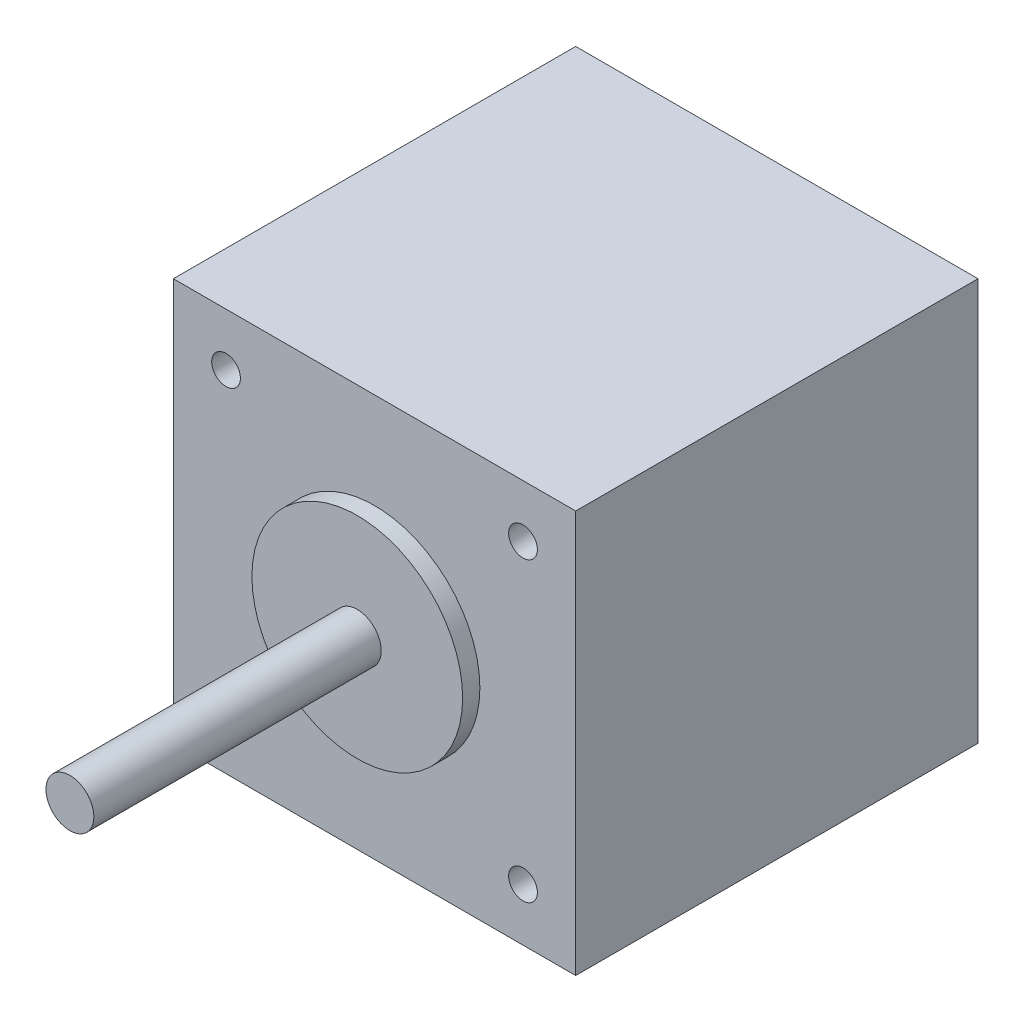
ISO-10303-21;
HEADER;
FILE_DESCRIPTION(('STEP AP214'),'2;1');
FILE_NAME('part.step','',(''),(''),'','','');
FILE_SCHEMA(('AUTOMOTIVE_DESIGN { 1 0 10303 214 1 1 1 1 }'));
ENDSEC;
DATA;
#1=APPLICATION_CONTEXT('core data for automotive mechanical design processes');
#2=APPLICATION_PROTOCOL_DEFINITION('international standard','automotive_design',2000,#1);
#3=PRODUCT_CONTEXT('',#1,'mechanical');
#4=PRODUCT('Part','Part','',(#3));
#5=PRODUCT_RELATED_PRODUCT_CATEGORY('part','',(#4));
#6=PRODUCT_DEFINITION_FORMATION('','',#4);
#7=PRODUCT_DEFINITION_CONTEXT('part definition',#1,'design');
#8=PRODUCT_DEFINITION('design','',#6,#7);
#9=PRODUCT_DEFINITION_SHAPE('','',#8);
#10=(LENGTH_UNIT() NAMED_UNIT(*) SI_UNIT(.MILLI.,.METRE.));
#11=(NAMED_UNIT(*) PLANE_ANGLE_UNIT() SI_UNIT($,.RADIAN.));
#12=(NAMED_UNIT(*) SI_UNIT($,.STERADIAN.) SOLID_ANGLE_UNIT());
#13=UNCERTAINTY_MEASURE_WITH_UNIT(LENGTH_MEASURE(1.E-05),#10,'distance_accuracy_value','');
#14=(GEOMETRIC_REPRESENTATION_CONTEXT(3) GLOBAL_UNCERTAINTY_ASSIGNED_CONTEXT((#13)) GLOBAL_UNIT_ASSIGNED_CONTEXT((#10,
#11,#12)) REPRESENTATION_CONTEXT('',''));
#15=CARTESIAN_POINT('',(0.,0.,0.));
#16=DIRECTION('',(0.,0.,1.));
#17=DIRECTION('',(1.,0.,0.));
#18=AXIS2_PLACEMENT_3D('',#15,#16,#17);
#19=CARTESIAN_POINT('',(-21.,-21.,42.));
#20=DIRECTION('',(1.,0.,0.));
#21=DIRECTION('',(0.,0.,-1.));
#22=AXIS2_PLACEMENT_3D('',#19,#20,#21);
#23=PLANE('',#22);
#24=DIRECTION('',(0.,-1.,0.));
#25=VECTOR('',#24,1.);
#26=CARTESIAN_POINT('',(-21.,-21.,0.));
#27=LINE('',#26,#25);
#28=CARTESIAN_POINT('',(-21.,21.,0.));
#29=VERTEX_POINT('',#28);
#30=CARTESIAN_POINT('',(-21.,-21.,0.));
#31=VERTEX_POINT('',#30);
#32=EDGE_CURVE('E99',#29,#31,#27,.T.);
#33=ORIENTED_EDGE('',*,*,#32,.T.);
#34=DIRECTION('',(0.,0.,-1.));
#35=VECTOR('',#34,1.);
#36=CARTESIAN_POINT('',(-21.,-21.,42.));
#37=LINE('',#36,#35);
#38=CARTESIAN_POINT('',(-21.,-21.,42.));
#39=VERTEX_POINT('',#38);
#40=EDGE_CURVE('E36',#39,#31,#37,.T.);
#41=ORIENTED_EDGE('',*,*,#40,.F.);
#42=DIRECTION('',(0.,-1.,0.));
#43=VECTOR('',#42,1.);
#44=CARTESIAN_POINT('',(-21.,-21.,42.));
#45=LINE('',#44,#43);
#46=CARTESIAN_POINT('',(-21.,21.,42.));
#47=VERTEX_POINT('',#46);
#48=EDGE_CURVE('E86',#47,#39,#45,.T.);
#49=ORIENTED_EDGE('',*,*,#48,.F.);
#50=DIRECTION('',(0.,0.,-1.));
#51=VECTOR('',#50,1.);
#52=CARTESIAN_POINT('',(-21.,21.,42.));
#53=LINE('',#52,#51);
#54=EDGE_CURVE('E95',#47,#29,#53,.T.);
#55=ORIENTED_EDGE('',*,*,#54,.T.);
#56=EDGE_LOOP('',(#33,#41,#49,#55));
#57=FACE_BOUND('',#56,.T.);
#58=ADVANCED_FACE('F33',(#57),#23,.F.);
#59=CARTESIAN_POINT('',(21.,-21.,42.));
#60=DIRECTION('',(0.,1.,0.));
#61=DIRECTION('',(-1.,0.,0.));
#62=AXIS2_PLACEMENT_3D('',#59,#60,#61);
#63=PLANE('',#62);
#64=DIRECTION('',(1.,0.,0.));
#65=VECTOR('',#64,1.);
#66=CARTESIAN_POINT('',(21.,-21.,0.));
#67=LINE('',#66,#65);
#68=CARTESIAN_POINT('',(21.,-21.,0.));
#69=VERTEX_POINT('',#68);
#70=EDGE_CURVE('E91',#31,#69,#67,.T.);
#71=ORIENTED_EDGE('',*,*,#70,.T.);
#72=DIRECTION('',(0.,0.,-1.));
#73=VECTOR('',#72,1.);
#74=CARTESIAN_POINT('',(21.,-21.,42.));
#75=LINE('',#74,#73);
#76=CARTESIAN_POINT('',(21.,-21.,42.));
#77=VERTEX_POINT('',#76);
#78=EDGE_CURVE('E89',#77,#69,#75,.T.);
#79=ORIENTED_EDGE('',*,*,#78,.F.);
#80=DIRECTION('',(1.,0.,0.));
#81=VECTOR('',#80,1.);
#82=CARTESIAN_POINT('',(21.,-21.,42.));
#83=LINE('',#82,#81);
#84=EDGE_CURVE('E81',#39,#77,#83,.T.);
#85=ORIENTED_EDGE('',*,*,#84,.F.);
#86=ORIENTED_EDGE('',*,*,#40,.T.);
#87=EDGE_LOOP('',(#71,#79,#85,#86));
#88=FACE_BOUND('',#87,.T.);
#89=ADVANCED_FACE('F90',(#88),#63,.F.);
#90=CARTESIAN_POINT('',(21.,-21.,42.));
#91=DIRECTION('',(-1.,0.,0.));
#92=DIRECTION('',(0.,0.,1.));
#93=AXIS2_PLACEMENT_3D('',#90,#91,#92);
#94=PLANE('',#93);
#95=DIRECTION('',(0.,1.,0.));
#96=VECTOR('',#95,1.);
#97=CARTESIAN_POINT('',(21.,-21.,0.));
#98=LINE('',#97,#96);
#99=CARTESIAN_POINT('',(21.,21.,0.));
#100=VERTEX_POINT('',#99);
#101=EDGE_CURVE('E67',#69,#100,#98,.T.);
#102=ORIENTED_EDGE('',*,*,#101,.T.);
#103=DIRECTION('',(0.,0.,-1.));
#104=VECTOR('',#103,1.);
#105=CARTESIAN_POINT('',(21.,21.,42.));
#106=LINE('',#105,#104);
#107=CARTESIAN_POINT('',(21.,21.,42.));
#108=VERTEX_POINT('',#107);
#109=EDGE_CURVE('E92',#108,#100,#106,.T.);
#110=ORIENTED_EDGE('',*,*,#109,.F.);
#111=DIRECTION('',(0.,1.,0.));
#112=VECTOR('',#111,1.);
#113=CARTESIAN_POINT('',(21.,-21.,42.));
#114=LINE('',#113,#112);
#115=EDGE_CURVE('E84',#77,#108,#114,.T.);
#116=ORIENTED_EDGE('',*,*,#115,.F.);
#117=ORIENTED_EDGE('',*,*,#78,.T.);
#118=EDGE_LOOP('',(#102,#110,#116,#117));
#119=FACE_BOUND('',#118,.T.);
#120=ADVANCED_FACE('F93',(#119),#94,.F.);
#121=CARTESIAN_POINT('',(21.,21.,42.));
#122=DIRECTION('',(0.,-1.,0.));
#123=DIRECTION('',(1.,0.,0.));
#124=AXIS2_PLACEMENT_3D('',#121,#122,#123);
#125=PLANE('',#124);
#126=DIRECTION('',(-1.,0.,0.));
#127=VECTOR('',#126,1.);
#128=CARTESIAN_POINT('',(21.,21.,0.));
#129=LINE('',#128,#127);
#130=EDGE_CURVE('E73',#100,#29,#129,.T.);
#131=ORIENTED_EDGE('',*,*,#130,.T.);
#132=ORIENTED_EDGE('',*,*,#54,.F.);
#133=DIRECTION('',(-1.,0.,0.));
#134=VECTOR('',#133,1.);
#135=CARTESIAN_POINT('',(21.,21.,42.));
#136=LINE('',#135,#134);
#137=EDGE_CURVE('E50',#108,#47,#136,.T.);
#138=ORIENTED_EDGE('',*,*,#137,.F.);
#139=ORIENTED_EDGE('',*,*,#109,.T.);
#140=EDGE_LOOP('',(#131,#132,#138,#139));
#141=FACE_BOUND('',#140,.T.);
#142=ADVANCED_FACE('F107',(#141),#125,.F.);
#143=CARTESIAN_POINT('',(0.,0.,42.));
#144=DIRECTION('',(0.,0.,1.));
#145=DIRECTION('',(1.,0.,0.));
#146=AXIS2_PLACEMENT_3D('',#143,#144,#145);
#147=PLANE('',#146);
#148=CARTESIAN_POINT('',(0.,0.,42.));
#149=DIRECTION('',(0.,0.,1.));
#150=DIRECTION('',(1.,0.,0.));
#151=AXIS2_PLACEMENT_3D('',#148,#149,#150);
#152=CIRCLE('',#151,11.);
#153=CARTESIAN_POINT('',(11.,0.,42.));
#154=VERTEX_POINT('',#153);
#155=EDGE_CURVE('E137',#154,#154,#152,.T.);
#156=ORIENTED_EDGE('',*,*,#155,.F.);
#157=EDGE_LOOP('',(#156));
#158=FACE_BOUND('',#157,.T.);
#159=CARTESIAN_POINT('',(15.5,-15.5,42.));
#160=DIRECTION('',(0.,0.,1.));
#161=DIRECTION('',(-1.,0.,0.));
#162=AXIS2_PLACEMENT_3D('',#159,#160,#161);
#163=CIRCLE('',#162,1.5);
#164=CARTESIAN_POINT('',(14.,-15.5,42.));
#165=VERTEX_POINT('',#164);
#166=EDGE_CURVE('E119',#165,#165,#163,.T.);
#167=ORIENTED_EDGE('',*,*,#166,.F.);
#168=EDGE_LOOP('',(#167));
#169=FACE_BOUND('',#168,.T.);
#170=CARTESIAN_POINT('',(-15.5,-15.5,42.));
#171=DIRECTION('',(0.,0.,1.));
#172=DIRECTION('',(1.,0.,0.));
#173=AXIS2_PLACEMENT_3D('',#170,#171,#172);
#174=CIRCLE('',#173,1.5);
#175=CARTESIAN_POINT('',(-14.,-15.5,42.));
#176=VERTEX_POINT('',#175);
#177=EDGE_CURVE('E126',#176,#176,#174,.T.);
#178=ORIENTED_EDGE('',*,*,#177,.F.);
#179=EDGE_LOOP('',(#178));
#180=FACE_BOUND('',#179,.T.);
#181=CARTESIAN_POINT('',(-15.5,15.5,42.));
#182=DIRECTION('',(0.,0.,1.));
#183=DIRECTION('',(-1.,0.,0.));
#184=AXIS2_PLACEMENT_3D('',#181,#182,#183);
#185=CIRCLE('',#184,1.5);
#186=CARTESIAN_POINT('',(-17.,15.5,42.));
#187=VERTEX_POINT('',#186);
#188=EDGE_CURVE('E132',#187,#187,#185,.T.);
#189=ORIENTED_EDGE('',*,*,#188,.F.);
#190=EDGE_LOOP('',(#189));
#191=FACE_BOUND('',#190,.T.);
#192=CARTESIAN_POINT('',(15.5,15.5,42.));
#193=DIRECTION('',(0.,0.,1.));
#194=DIRECTION('',(1.,0.,0.));
#195=AXIS2_PLACEMENT_3D('',#192,#193,#194);
#196=CIRCLE('',#195,1.5);
#197=CARTESIAN_POINT('',(17.,15.5,42.));
#198=VERTEX_POINT('',#197);
#199=EDGE_CURVE('E113',#198,#198,#196,.T.);
#200=ORIENTED_EDGE('',*,*,#199,.F.);
#201=EDGE_LOOP('',(#200));
#202=FACE_BOUND('',#201,.T.);
#203=ORIENTED_EDGE('',*,*,#48,.T.);
#204=ORIENTED_EDGE('',*,*,#84,.T.);
#205=ORIENTED_EDGE('',*,*,#115,.T.);
#206=ORIENTED_EDGE('',*,*,#137,.T.);
#207=EDGE_LOOP('',(#203,#204,#205,#206));
#208=FACE_BOUND('',#207,.T.);
#209=ADVANCED_FACE('F82',(#158,#169,#180,#191,#202,#208),#147,.T.);
#210=CARTESIAN_POINT('',(0.,0.,0.));
#211=DIRECTION('',(0.,0.,1.));
#212=DIRECTION('',(1.,0.,0.));
#213=AXIS2_PLACEMENT_3D('',#210,#211,#212);
#214=PLANE('',#213);
#215=ORIENTED_EDGE('',*,*,#32,.F.);
#216=ORIENTED_EDGE('',*,*,#130,.F.);
#217=ORIENTED_EDGE('',*,*,#101,.F.);
#218=ORIENTED_EDGE('',*,*,#70,.F.);
#219=EDGE_LOOP('',(#215,#216,#217,#218));
#220=FACE_BOUND('',#219,.T.);
#221=ADVANCED_FACE('F110',(#220),#214,.F.);
#222=CARTESIAN_POINT('',(15.5,15.5,32.));
#223=DIRECTION('',(0.,0.,1.));
#224=DIRECTION('',(1.,0.,0.));
#225=AXIS2_PLACEMENT_3D('',#222,#223,#224);
#226=CYLINDRICAL_SURFACE('',#225,1.5);
#227=CARTESIAN_POINT('',(15.5,15.5,32.));
#228=DIRECTION('',(0.,0.,1.));
#229=DIRECTION('',(1.,0.,0.));
#230=AXIS2_PLACEMENT_3D('',#227,#228,#229);
#231=CIRCLE('',#230,1.5);
#232=CARTESIAN_POINT('',(17.,15.5,32.));
#233=VERTEX_POINT('',#232);
#234=EDGE_CURVE('E102',#233,#233,#231,.T.);
#235=ORIENTED_EDGE('',*,*,#234,.F.);
#236=EDGE_LOOP('',(#235));
#237=FACE_BOUND('',#236,.T.);
#238=ORIENTED_EDGE('',*,*,#199,.T.);
#239=EDGE_LOOP('',(#238));
#240=FACE_BOUND('',#239,.T.);
#241=ADVANCED_FACE('F178',(#237,#240),#226,.F.);
#242=CARTESIAN_POINT('',(15.5,15.5,32.));
#243=DIRECTION('',(0.,0.,1.));
#244=DIRECTION('',(1.,0.,0.));
#245=AXIS2_PLACEMENT_3D('',#242,#243,#244);
#246=PLANE('',#245);
#247=ORIENTED_EDGE('',*,*,#234,.T.);
#248=EDGE_LOOP('',(#247));
#249=FACE_BOUND('',#248,.T.);
#250=ADVANCED_FACE('F180',(#249),#246,.T.);
#251=CARTESIAN_POINT('',(-15.5,15.5,32.));
#252=DIRECTION('',(0.,0.,1.));
#253=DIRECTION('',(1.,0.,0.));
#254=AXIS2_PLACEMENT_3D('',#251,#252,#253);
#255=CYLINDRICAL_SURFACE('',#254,1.5);
#256=CARTESIAN_POINT('',(-15.5,15.5,32.));
#257=DIRECTION('',(0.,0.,1.));
#258=DIRECTION('',(-1.,0.,0.));
#259=AXIS2_PLACEMENT_3D('',#256,#257,#258);
#260=CIRCLE('',#259,1.5);
#261=CARTESIAN_POINT('',(-17.,15.5,32.));
#262=VERTEX_POINT('',#261);
#263=EDGE_CURVE('E116',#262,#262,#260,.T.);
#264=ORIENTED_EDGE('',*,*,#263,.F.);
#265=EDGE_LOOP('',(#264));
#266=FACE_BOUND('',#265,.T.);
#267=ORIENTED_EDGE('',*,*,#188,.T.);
#268=EDGE_LOOP('',(#267));
#269=FACE_BOUND('',#268,.T.);
#270=ADVANCED_FACE('F187',(#266,#269),#255,.F.);
#271=CARTESIAN_POINT('',(-15.5,15.5,32.));
#272=DIRECTION('',(0.,0.,-1.));
#273=DIRECTION('',(-1.,0.,0.));
#274=AXIS2_PLACEMENT_3D('',#271,#272,#273);
#275=PLANE('',#274);
#276=ORIENTED_EDGE('',*,*,#263,.T.);
#277=EDGE_LOOP('',(#276));
#278=FACE_BOUND('',#277,.T.);
#279=ADVANCED_FACE('F235',(#278),#275,.F.);
#280=CARTESIAN_POINT('',(-15.5,-15.5,32.));
#281=DIRECTION('',(0.,0.,1.));
#282=DIRECTION('',(1.,0.,0.));
#283=AXIS2_PLACEMENT_3D('',#280,#281,#282);
#284=CYLINDRICAL_SURFACE('',#283,1.5);
#285=CARTESIAN_POINT('',(-15.5,-15.5,32.));
#286=DIRECTION('',(0.,0.,1.));
#287=DIRECTION('',(1.,0.,0.));
#288=AXIS2_PLACEMENT_3D('',#285,#286,#287);
#289=CIRCLE('',#288,1.5);
#290=CARTESIAN_POINT('',(-14.,-15.5,32.));
#291=VERTEX_POINT('',#290);
#292=EDGE_CURVE('E129',#291,#291,#289,.T.);
#293=ORIENTED_EDGE('',*,*,#292,.F.);
#294=EDGE_LOOP('',(#293));
#295=FACE_BOUND('',#294,.T.);
#296=ORIENTED_EDGE('',*,*,#177,.T.);
#297=EDGE_LOOP('',(#296));
#298=FACE_BOUND('',#297,.T.);
#299=ADVANCED_FACE('F245',(#295,#298),#284,.F.);
#300=CARTESIAN_POINT('',(-15.5,-15.5,32.));
#301=DIRECTION('',(0.,0.,1.));
#302=DIRECTION('',(1.,0.,0.));
#303=AXIS2_PLACEMENT_3D('',#300,#301,#302);
#304=PLANE('',#303);
#305=ORIENTED_EDGE('',*,*,#292,.T.);
#306=EDGE_LOOP('',(#305));
#307=FACE_BOUND('',#306,.T.);
#308=ADVANCED_FACE('F255',(#307),#304,.T.);
#309=CARTESIAN_POINT('',(15.5,-15.5,32.));
#310=DIRECTION('',(0.,0.,1.));
#311=DIRECTION('',(1.,0.,0.));
#312=AXIS2_PLACEMENT_3D('',#309,#310,#311);
#313=CYLINDRICAL_SURFACE('',#312,1.5);
#314=CARTESIAN_POINT('',(15.5,-15.5,32.));
#315=DIRECTION('',(0.,0.,1.));
#316=DIRECTION('',(-1.,0.,0.));
#317=AXIS2_PLACEMENT_3D('',#314,#315,#316);
#318=CIRCLE('',#317,1.5);
#319=CARTESIAN_POINT('',(14.,-15.5,32.));
#320=VERTEX_POINT('',#319);
#321=EDGE_CURVE('E122',#320,#320,#318,.T.);
#322=ORIENTED_EDGE('',*,*,#321,.F.);
#323=EDGE_LOOP('',(#322));
#324=FACE_BOUND('',#323,.T.);
#325=ORIENTED_EDGE('',*,*,#166,.T.);
#326=EDGE_LOOP('',(#325));
#327=FACE_BOUND('',#326,.T.);
#328=ADVANCED_FACE('F265',(#324,#327),#313,.F.);
#329=CARTESIAN_POINT('',(15.5,-15.5,32.));
#330=DIRECTION('',(0.,0.,-1.));
#331=DIRECTION('',(-1.,0.,0.));
#332=AXIS2_PLACEMENT_3D('',#329,#330,#331);
#333=PLANE('',#332);
#334=ORIENTED_EDGE('',*,*,#321,.T.);
#335=EDGE_LOOP('',(#334));
#336=FACE_BOUND('',#335,.T.);
#337=ADVANCED_FACE('F163',(#336),#333,.F.);
#338=CARTESIAN_POINT('',(0.,0.,43.8));
#339=DIRECTION('',(0.,0.,-1.));
#340=DIRECTION('',(-1.,0.,0.));
#341=AXIS2_PLACEMENT_3D('',#338,#339,#340);
#342=CYLINDRICAL_SURFACE('',#341,11.);
#343=CARTESIAN_POINT('',(0.,0.,43.8));
#344=DIRECTION('',(0.,0.,1.));
#345=DIRECTION('',(1.,0.,0.));
#346=AXIS2_PLACEMENT_3D('',#343,#344,#345);
#347=CIRCLE('',#346,11.);
#348=CARTESIAN_POINT('',(11.,0.,43.8));
#349=VERTEX_POINT('',#348);
#350=EDGE_CURVE('E123',#349,#349,#347,.T.);
#351=ORIENTED_EDGE('',*,*,#350,.F.);
#352=EDGE_LOOP('',(#351));
#353=FACE_BOUND('',#352,.T.);
#354=ORIENTED_EDGE('',*,*,#155,.T.);
#355=EDGE_LOOP('',(#354));
#356=FACE_BOUND('',#355,.T.);
#357=ADVANCED_FACE('F157',(#353,#356),#342,.T.);
#358=CARTESIAN_POINT('',(0.,0.,43.8));
#359=DIRECTION('',(0.,0.,1.));
#360=DIRECTION('',(1.,0.,0.));
#361=AXIS2_PLACEMENT_3D('',#358,#359,#360);
#362=PLANE('',#361);
#363=CARTESIAN_POINT('',(0.,0.,43.8));
#364=DIRECTION('',(0.,0.,1.));
#365=DIRECTION('',(1.,0.,0.));
#366=AXIS2_PLACEMENT_3D('',#363,#364,#365);
#367=CIRCLE('',#366,2.5);
#368=CARTESIAN_POINT('',(2.5,0.,43.8));
#369=VERTEX_POINT('',#368);
#370=EDGE_CURVE('E11',#369,#369,#367,.T.);
#371=ORIENTED_EDGE('',*,*,#370,.F.);
#372=EDGE_LOOP('',(#371));
#373=FACE_BOUND('',#372,.T.);
#374=ORIENTED_EDGE('',*,*,#350,.T.);
#375=EDGE_LOOP('',(#374));
#376=FACE_BOUND('',#375,.T.);
#377=ADVANCED_FACE('F151',(#373,#376),#362,.T.);
#378=CARTESIAN_POINT('',(0.,0.,73.8));
#379=DIRECTION('',(0.,0.,-1.));
#380=DIRECTION('',(-1.,0.,0.));
#381=AXIS2_PLACEMENT_3D('',#378,#379,#380);
#382=CYLINDRICAL_SURFACE('',#381,2.5);
#383=CARTESIAN_POINT('',(0.,0.,73.8));
#384=DIRECTION('',(0.,0.,1.));
#385=DIRECTION('',(1.,0.,0.));
#386=AXIS2_PLACEMENT_3D('',#383,#384,#385);
#387=CIRCLE('',#386,2.5);
#388=CARTESIAN_POINT('',(2.5,0.,73.8));
#389=VERTEX_POINT('',#388);
#390=EDGE_CURVE('E140',#389,#389,#387,.T.);
#391=ORIENTED_EDGE('',*,*,#390,.F.);
#392=EDGE_LOOP('',(#391));
#393=FACE_BOUND('',#392,.T.);
#394=ORIENTED_EDGE('',*,*,#370,.T.);
#395=EDGE_LOOP('',(#394));
#396=FACE_BOUND('',#395,.T.);
#397=ADVANCED_FACE('F148',(#393,#396),#382,.T.);
#398=CARTESIAN_POINT('',(0.,0.,73.8));
#399=DIRECTION('',(0.,0.,1.));
#400=DIRECTION('',(1.,0.,0.));
#401=AXIS2_PLACEMENT_3D('',#398,#399,#400);
#402=PLANE('',#401);
#403=ORIENTED_EDGE('',*,*,#390,.T.);
#404=EDGE_LOOP('',(#403));
#405=FACE_BOUND('',#404,.T.);
#406=ADVANCED_FACE('F146',(#405),#402,.T.);
#407=CLOSED_SHELL('',(#58,#89,#120,#142,#209,#221,#241,#250,#270,#279,#299,#308,#328,#337,#357,
#377,#397,#406));
#408=MANIFOLD_SOLID_BREP('B2',#407);
#409=ADVANCED_BREP_SHAPE_REPRESENTATION('',(#18,#408),#14);
#410=SHAPE_DEFINITION_REPRESENTATION(#9,#409);
ENDSEC;
END-ISO-10303-21;
